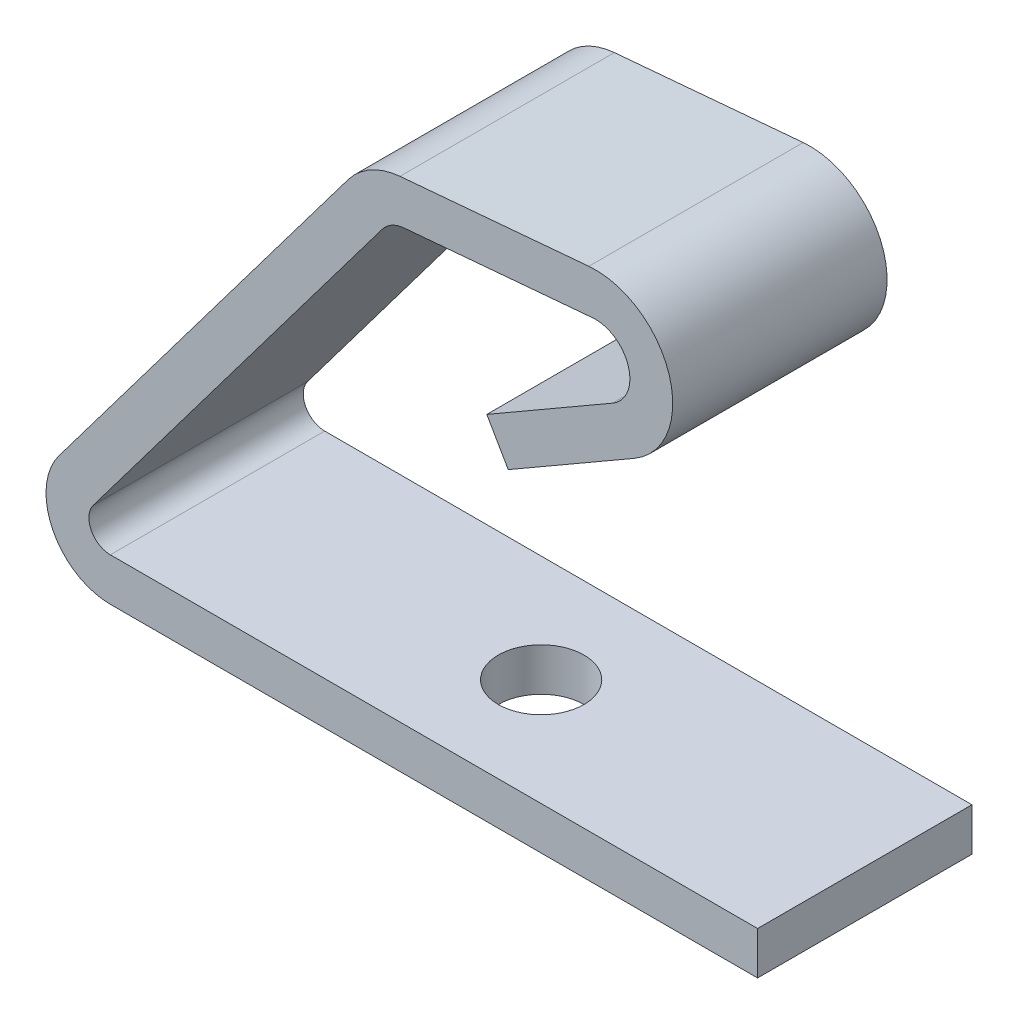
ISO-10303-21;
HEADER;
FILE_DESCRIPTION(('STEP AP214'),'2;1');
FILE_NAME('part.step','',(''),(''),'','','');
FILE_SCHEMA(('AUTOMOTIVE_DESIGN { 1 0 10303 214 1 1 1 1 }'));
ENDSEC;
DATA;
#1=APPLICATION_CONTEXT('core data for automotive mechanical design processes');
#2=APPLICATION_PROTOCOL_DEFINITION('international standard','automotive_design',2000,#1);
#3=PRODUCT_CONTEXT('',#1,'mechanical');
#4=PRODUCT('Part','Part','',(#3));
#5=PRODUCT_RELATED_PRODUCT_CATEGORY('part','',(#4));
#6=PRODUCT_DEFINITION_FORMATION('','',#4);
#7=PRODUCT_DEFINITION_CONTEXT('part definition',#1,'design');
#8=PRODUCT_DEFINITION('design','',#6,#7);
#9=PRODUCT_DEFINITION_SHAPE('','',#8);
#10=(LENGTH_UNIT() NAMED_UNIT(*) SI_UNIT(.MILLI.,.METRE.));
#11=(NAMED_UNIT(*) PLANE_ANGLE_UNIT() SI_UNIT($,.RADIAN.));
#12=(NAMED_UNIT(*) SI_UNIT($,.STERADIAN.) SOLID_ANGLE_UNIT());
#13=UNCERTAINTY_MEASURE_WITH_UNIT(LENGTH_MEASURE(1.E-05),#10,'distance_accuracy_value','');
#14=(GEOMETRIC_REPRESENTATION_CONTEXT(3) GLOBAL_UNCERTAINTY_ASSIGNED_CONTEXT((#13)) GLOBAL_UNIT_ASSIGNED_CONTEXT((#10,
#11,#12)) REPRESENTATION_CONTEXT('',''));
#15=CARTESIAN_POINT('',(0.,0.,0.));
#16=DIRECTION('',(0.,0.,1.));
#17=DIRECTION('',(1.,0.,0.));
#18=AXIS2_PLACEMENT_3D('',#15,#16,#17);
#19=CARTESIAN_POINT('',(11.6209040974575,8.922788872475,5.));
#20=DIRECTION('',(0.499999999999994,-0.866025403784442,0.));
#21=DIRECTION('',(0.866025403784442,0.499999999999994,0.));
#22=AXIS2_PLACEMENT_3D('',#19,#20,#21);
#23=PLANE('',#22);
#24=DIRECTION('',(-0.866025403784442,-0.499999999999994,0.));
#25=VECTOR('',#24,1.);
#26=CARTESIAN_POINT('',(11.6209040974575,8.922788872475,0.));
#27=LINE('',#26,#25);
#28=CARTESIAN_POINT('',(11.6209040974575,8.922788872475,0.));
#29=VERTEX_POINT('',#28);
#30=CARTESIAN_POINT('',(8.68383679355672,7.22707227393987,0.));
#31=VERTEX_POINT('',#30);
#32=EDGE_CURVE('E176',#29,#31,#27,.T.);
#33=ORIENTED_EDGE('',*,*,#32,.T.);
#34=DIRECTION('',(0.,0.,-1.));
#35=VECTOR('',#34,1.);
#36=CARTESIAN_POINT('',(8.68383679355672,7.22707227393987,5.));
#37=LINE('',#36,#35);
#38=CARTESIAN_POINT('',(8.68383679355672,7.22707227393987,5.));
#39=VERTEX_POINT('',#38);
#40=EDGE_CURVE('E11',#39,#31,#37,.T.);
#41=ORIENTED_EDGE('',*,*,#40,.F.);
#42=DIRECTION('',(-0.866025403784442,-0.499999999999994,0.));
#43=VECTOR('',#42,1.);
#44=CARTESIAN_POINT('',(11.6209040974575,8.922788872475,5.));
#45=LINE('',#44,#43);
#46=CARTESIAN_POINT('',(11.6209040974575,8.922788872475,5.));
#47=VERTEX_POINT('',#46);
#48=EDGE_CURVE('E113',#47,#39,#45,.T.);
#49=ORIENTED_EDGE('',*,*,#48,.F.);
#50=DIRECTION('',(0.,0.,-1.));
#51=VECTOR('',#50,1.);
#52=CARTESIAN_POINT('',(11.6209040974575,8.922788872475,5.));
#53=LINE('',#52,#51);
#54=EDGE_CURVE('E172',#47,#29,#53,.T.);
#55=ORIENTED_EDGE('',*,*,#54,.T.);
#56=EDGE_LOOP('',(#33,#41,#49,#55));
#57=FACE_BOUND('',#56,.T.);
#58=ADVANCED_FACE('F33',(#57),#23,.F.);
#59=CARTESIAN_POINT('',(9.18383679355671,6.36104687015543,5.));
#60=DIRECTION('',(-0.866025403784442,-0.499999999999993,0.));
#61=DIRECTION('',(0.499999999999993,-0.866025403784442,0.));
#62=AXIS2_PLACEMENT_3D('',#59,#60,#61);
#63=PLANE('',#62);
#64=DIRECTION('',(-0.499999999999993,0.866025403784442,0.));
#65=VECTOR('',#64,1.);
#66=CARTESIAN_POINT('',(9.18383679355671,6.36104687015543,0.));
#67=LINE('',#66,#65);
#68=CARTESIAN_POINT('',(9.18383679355671,6.36104687015543,0.));
#69=VERTEX_POINT('',#68);
#70=EDGE_CURVE('E179',#69,#31,#67,.T.);
#71=ORIENTED_EDGE('',*,*,#70,.F.);
#72=DIRECTION('',(0.,0.,-1.));
#73=VECTOR('',#72,1.);
#74=CARTESIAN_POINT('',(9.18383679355671,6.36104687015543,5.));
#75=LINE('',#74,#73);
#76=CARTESIAN_POINT('',(9.18383679355671,6.36104687015543,5.));
#77=VERTEX_POINT('',#76);
#78=EDGE_CURVE('E41',#77,#69,#75,.T.);
#79=ORIENTED_EDGE('',*,*,#78,.F.);
#80=DIRECTION('',(-0.499999999999993,0.866025403784442,0.));
#81=VECTOR('',#80,1.);
#82=CARTESIAN_POINT('',(9.18383679355671,6.36104687015543,5.));
#83=LINE('',#82,#81);
#84=EDGE_CURVE('E263',#77,#39,#83,.T.);
#85=ORIENTED_EDGE('',*,*,#84,.T.);
#86=ORIENTED_EDGE('',*,*,#40,.T.);
#87=EDGE_LOOP('',(#71,#79,#85,#86));
#88=FACE_BOUND('',#87,.T.);
#89=ADVANCED_FACE('F250',(#88),#63,.T.);
#90=CARTESIAN_POINT('',(12.1209040974575,8.05676346869056,5.));
#91=DIRECTION('',(0.499999999999994,-0.866025403784442,0.));
#92=DIRECTION('',(0.866025403784442,0.499999999999994,0.));
#93=AXIS2_PLACEMENT_3D('',#90,#91,#92);
#94=PLANE('',#93);
#95=DIRECTION('',(-0.866025403784442,-0.499999999999994,0.));
#96=VECTOR('',#95,1.);
#97=CARTESIAN_POINT('',(12.1209040974575,8.05676346869056,0.));
#98=LINE('',#97,#96);
#99=CARTESIAN_POINT('',(12.1209040974575,8.05676346869056,0.));
#100=VERTEX_POINT('',#99);
#101=EDGE_CURVE('E183',#100,#69,#98,.T.);
#102=ORIENTED_EDGE('',*,*,#101,.F.);
#103=DIRECTION('',(0.,0.,-1.));
#104=VECTOR('',#103,1.);
#105=CARTESIAN_POINT('',(12.1209040974575,8.05676346869056,5.));
#106=LINE('',#105,#104);
#107=CARTESIAN_POINT('',(12.1209040974575,8.05676346869056,5.));
#108=VERTEX_POINT('',#107);
#109=EDGE_CURVE('E240',#108,#100,#106,.T.);
#110=ORIENTED_EDGE('',*,*,#109,.F.);
#111=DIRECTION('',(-0.866025403784442,-0.499999999999994,0.));
#112=VECTOR('',#111,1.);
#113=CARTESIAN_POINT('',(12.1209040974575,8.05676346869056,5.));
#114=LINE('',#113,#112);
#115=EDGE_CURVE('E247',#108,#77,#114,.T.);
#116=ORIENTED_EDGE('',*,*,#115,.T.);
#117=ORIENTED_EDGE('',*,*,#78,.T.);
#118=EDGE_LOOP('',(#102,#110,#116,#117));
#119=FACE_BOUND('',#118,.T.);
#120=ADVANCED_FACE('F245',(#119),#94,.T.);
#121=CARTESIAN_POINT('',(11.2209040974575,9.61560919550256,5.));
#122=DIRECTION('',(0.,0.,-1.));
#123=DIRECTION('',(-1.,0.,0.));
#124=AXIS2_PLACEMENT_3D('',#121,#122,#123);
#125=CYLINDRICAL_SURFACE('',#124,1.8);
#126=CARTESIAN_POINT('',(11.2209040974575,9.61560919550256,0.));
#127=DIRECTION('',(0.,0.,1.));
#128=DIRECTION('',(1.,0.,0.));
#129=AXIS2_PLACEMENT_3D('',#126,#127,#128);
#130=CIRCLE('',#129,1.8);
#131=CARTESIAN_POINT('',(11.0640237605117,11.4087596520677,0.));
#132=VERTEX_POINT('',#131);
#133=EDGE_CURVE('E186',#132,#100,#130,.F.);
#134=ORIENTED_EDGE('',*,*,#133,.F.);
#135=DIRECTION('',(0.,0.,-1.));
#136=VECTOR('',#135,1.);
#137=CARTESIAN_POINT('',(11.0640237605117,11.4087596520677,5.));
#138=LINE('',#137,#136);
#139=CARTESIAN_POINT('',(11.0640237605117,11.4087596520677,5.));
#140=VERTEX_POINT('',#139);
#141=EDGE_CURVE('E238',#140,#132,#138,.T.);
#142=ORIENTED_EDGE('',*,*,#141,.F.);
#143=CARTESIAN_POINT('',(11.2209040974575,9.61560919550256,5.));
#144=DIRECTION('',(0.,0.,1.));
#145=DIRECTION('',(1.,0.,0.));
#146=AXIS2_PLACEMENT_3D('',#143,#144,#145);
#147=CIRCLE('',#146,1.8);
#148=EDGE_CURVE('E260',#140,#108,#147,.F.);
#149=ORIENTED_EDGE('',*,*,#148,.T.);
#150=ORIENTED_EDGE('',*,*,#109,.T.);
#151=EDGE_LOOP('',(#134,#142,#149,#150));
#152=FACE_BOUND('',#151,.T.);
#153=ADVANCED_FACE('F257',(#152),#125,.T.);
#154=CARTESIAN_POINT('',(6.65885887730015,11.0233576638242,5.));
#155=DIRECTION('',(-0.0871557427476582,0.996194698091746,0.));
#156=DIRECTION('',(-0.996194698091746,-0.0871557427476582,0.));
#157=AXIS2_PLACEMENT_3D('',#154,#155,#156);
#158=PLANE('',#157);
#159=DIRECTION('',(0.996194698091746,0.0871557427476582,0.));
#160=VECTOR('',#159,1.);
#161=CARTESIAN_POINT('',(6.65885887730015,11.0233576638242,0.));
#162=LINE('',#161,#160);
#163=CARTESIAN_POINT('',(6.65885887730015,11.0233576638242,0.));
#164=VERTEX_POINT('',#163);
#165=EDGE_CURVE('E189',#164,#132,#162,.T.);
#166=ORIENTED_EDGE('',*,*,#165,.F.);
#167=DIRECTION('',(0.,0.,-1.));
#168=VECTOR('',#167,1.);
#169=CARTESIAN_POINT('',(6.65885887730015,11.0233576638242,5.));
#170=LINE('',#169,#168);
#171=CARTESIAN_POINT('',(6.65885887730015,11.0233576638242,5.));
#172=VERTEX_POINT('',#171);
#173=EDGE_CURVE('E236',#172,#164,#170,.T.);
#174=ORIENTED_EDGE('',*,*,#173,.F.);
#175=DIRECTION('',(0.996194698091746,0.0871557427476582,0.));
#176=VECTOR('',#175,1.);
#177=CARTESIAN_POINT('',(6.65885887730015,11.0233576638242,5.));
#178=LINE('',#177,#176);
#179=EDGE_CURVE('E265',#172,#140,#178,.T.);
#180=ORIENTED_EDGE('',*,*,#179,.T.);
#181=ORIENTED_EDGE('',*,*,#141,.T.);
#182=EDGE_LOOP('',(#166,#174,#180,#181));
#183=FACE_BOUND('',#182,.T.);
#184=ADVANCED_FACE('F322',(#183),#158,.T.);
#185=CARTESIAN_POINT('',(6.80702363997117,9.32982667706822,5.));
#186=DIRECTION('',(0.,0.,-1.));
#187=DIRECTION('',(-1.,0.,0.));
#188=AXIS2_PLACEMENT_3D('',#185,#186,#187);
#189=CYLINDRICAL_SURFACE('',#188,1.7);
#190=CARTESIAN_POINT('',(6.80702363997117,9.32982667706822,0.));
#191=DIRECTION('',(0.,0.,1.));
#192=DIRECTION('',(1.,0.,0.));
#193=AXIS2_PLACEMENT_3D('',#190,#191,#192);
#194=CIRCLE('',#193,1.7);
#195=CARTESIAN_POINT('',(5.44934327289077,10.3529122164267,0.));
#196=VERTEX_POINT('',#195);
#197=EDGE_CURVE('E192',#196,#164,#194,.F.);
#198=ORIENTED_EDGE('',*,*,#197,.F.);
#199=DIRECTION('',(0.,0.,-1.));
#200=VECTOR('',#199,1.);
#201=CARTESIAN_POINT('',(5.44934327289077,10.3529122164267,5.));
#202=LINE('',#201,#200);
#203=CARTESIAN_POINT('',(5.44934327289077,10.3529122164267,5.));
#204=VERTEX_POINT('',#203);
#205=EDGE_CURVE('E234',#204,#196,#202,.T.);
#206=ORIENTED_EDGE('',*,*,#205,.F.);
#207=CARTESIAN_POINT('',(6.80702363997117,9.32982667706822,5.));
#208=DIRECTION('',(0.,0.,1.));
#209=DIRECTION('',(1.,0.,0.));
#210=AXIS2_PLACEMENT_3D('',#207,#208,#209);
#211=CIRCLE('',#210,1.7);
#212=EDGE_CURVE('E271',#204,#172,#211,.F.);
#213=ORIENTED_EDGE('',*,*,#212,.T.);
#214=ORIENTED_EDGE('',*,*,#173,.T.);
#215=EDGE_LOOP('',(#198,#206,#213,#214));
#216=FACE_BOUND('',#215,.T.);
#217=ADVANCED_FACE('F325',(#216),#189,.T.);
#218=CARTESIAN_POINT('',(-1.29510841094143,1.40272253472807,5.));
#219=DIRECTION('',(-0.798635510047294,0.601815023152046,0.));
#220=DIRECTION('',(-0.601815023152046,-0.798635510047294,0.));
#221=AXIS2_PLACEMENT_3D('',#218,#219,#220);
#222=PLANE('',#221);
#223=DIRECTION('',(0.601815023152046,0.798635510047294,0.));
#224=VECTOR('',#223,1.);
#225=CARTESIAN_POINT('',(-1.29510841094143,1.40272253472807,0.));
#226=LINE('',#225,#224);
#227=CARTESIAN_POINT('',(-1.29510841094143,1.40272253472807,0.));
#228=VERTEX_POINT('',#227);
#229=EDGE_CURVE('E195',#228,#196,#226,.T.);
#230=ORIENTED_EDGE('',*,*,#229,.F.);
#231=DIRECTION('',(0.,0.,-1.));
#232=VECTOR('',#231,1.);
#233=CARTESIAN_POINT('',(-1.29510841094143,1.40272253472807,5.));
#234=LINE('',#233,#232);
#235=CARTESIAN_POINT('',(-1.29510841094143,1.40272253472807,5.));
#236=VERTEX_POINT('',#235);
#237=EDGE_CURVE('E232',#236,#228,#234,.T.);
#238=ORIENTED_EDGE('',*,*,#237,.F.);
#239=DIRECTION('',(0.601815023152046,0.798635510047294,0.));
#240=VECTOR('',#239,1.);
#241=CARTESIAN_POINT('',(-1.29510841094143,1.40272253472807,5.));
#242=LINE('',#241,#240);
#243=EDGE_CURVE('E274',#236,#204,#242,.T.);
#244=ORIENTED_EDGE('',*,*,#243,.T.);
#245=ORIENTED_EDGE('',*,*,#205,.T.);
#246=EDGE_LOOP('',(#230,#238,#244,#245));
#247=FACE_BOUND('',#246,.T.);
#248=ADVANCED_FACE('F329',(#247),#222,.T.);
#249=CARTESIAN_POINT('',(-0.0971551458704927,0.5,5.));
#250=DIRECTION('',(0.,0.,-1.));
#251=DIRECTION('',(-1.,0.,0.));
#252=AXIS2_PLACEMENT_3D('',#249,#250,#251);
#253=CYLINDRICAL_SURFACE('',#252,1.5);
#254=CARTESIAN_POINT('',(-0.0971551458704927,0.5,0.));
#255=DIRECTION('',(0.,0.,1.));
#256=DIRECTION('',(1.,0.,0.));
#257=AXIS2_PLACEMENT_3D('',#254,#255,#256);
#258=CIRCLE('',#257,1.5);
#259=CARTESIAN_POINT('',(-0.097155145870493,-1.,0.));
#260=VERTEX_POINT('',#259);
#261=EDGE_CURVE('E198',#260,#228,#258,.F.);
#262=ORIENTED_EDGE('',*,*,#261,.F.);
#263=DIRECTION('',(0.,0.,-1.));
#264=VECTOR('',#263,1.);
#265=CARTESIAN_POINT('',(-0.097155145870493,-1.,5.));
#266=LINE('',#265,#264);
#267=CARTESIAN_POINT('',(-0.097155145870493,-1.,5.));
#268=VERTEX_POINT('',#267);
#269=EDGE_CURVE('E229',#268,#260,#266,.T.);
#270=ORIENTED_EDGE('',*,*,#269,.F.);
#271=CARTESIAN_POINT('',(-0.0971551458704927,0.5,5.));
#272=DIRECTION('',(0.,0.,1.));
#273=DIRECTION('',(1.,0.,0.));
#274=AXIS2_PLACEMENT_3D('',#271,#272,#273);
#275=CIRCLE('',#274,1.5);
#276=EDGE_CURVE('E277',#268,#236,#275,.F.);
#277=ORIENTED_EDGE('',*,*,#276,.T.);
#278=ORIENTED_EDGE('',*,*,#237,.T.);
#279=EDGE_LOOP('',(#262,#270,#277,#278));
#280=FACE_BOUND('',#279,.T.);
#281=ADVANCED_FACE('F333',(#280),#253,.T.);
#282=CARTESIAN_POINT('',(0.,-1.,5.));
#283=DIRECTION('',(0.,-1.,0.));
#284=DIRECTION('',(0.,0.,-1.));
#285=AXIS2_PLACEMENT_3D('',#282,#283,#284);
#286=PLANE('',#285);
#287=CARTESIAN_POINT('',(7.45142242706475,-1.,2.5));
#288=DIRECTION('',(0.,-1.,0.));
#289=DIRECTION('',(0.,0.,-1.));
#290=AXIS2_PLACEMENT_3D('',#287,#288,#289);
#291=CIRCLE('',#290,1.);
#292=CARTESIAN_POINT('',(7.45142242706475,-1.,1.5));
#293=VERTEX_POINT('',#292);
#294=EDGE_CURVE('E405',#293,#293,#291,.F.);
#295=ORIENTED_EDGE('',*,*,#294,.T.);
#296=EDGE_LOOP('',(#295));
#297=FACE_BOUND('',#296,.T.);
#298=DIRECTION('',(1.,0.,0.));
#299=VECTOR('',#298,1.);
#300=CARTESIAN_POINT('',(0.,-1.,0.));
#301=LINE('',#300,#299);
#302=CARTESIAN_POINT('',(15.,-1.,0.));
#303=VERTEX_POINT('',#302);
#304=EDGE_CURVE('E201',#303,#260,#301,.F.);
#305=ORIENTED_EDGE('',*,*,#304,.F.);
#306=DIRECTION('',(0.,0.,-1.));
#307=VECTOR('',#306,1.);
#308=CARTESIAN_POINT('',(15.,-1.,5.));
#309=LINE('',#308,#307);
#310=CARTESIAN_POINT('',(15.,-1.,5.));
#311=VERTEX_POINT('',#310);
#312=EDGE_CURVE('E227',#311,#303,#309,.T.);
#313=ORIENTED_EDGE('',*,*,#312,.F.);
#314=DIRECTION('',(1.,0.,0.));
#315=VECTOR('',#314,1.);
#316=CARTESIAN_POINT('',(0.,-1.,5.));
#317=LINE('',#316,#315);
#318=EDGE_CURVE('E280',#311,#268,#317,.F.);
#319=ORIENTED_EDGE('',*,*,#318,.T.);
#320=ORIENTED_EDGE('',*,*,#269,.T.);
#321=EDGE_LOOP('',(#305,#313,#319,#320));
#322=FACE_BOUND('',#321,.T.);
#323=ADVANCED_FACE('F337',(#297,#322),#286,.T.);
#324=CARTESIAN_POINT('',(15.,0.,5.));
#325=DIRECTION('',(1.,0.,0.));
#326=DIRECTION('',(0.,0.,-1.));
#327=AXIS2_PLACEMENT_3D('',#324,#325,#326);
#328=PLANE('',#327);
#329=DIRECTION('',(0.,-1.,0.));
#330=VECTOR('',#329,1.);
#331=CARTESIAN_POINT('',(15.,0.,0.));
#332=LINE('',#331,#330);
#333=CARTESIAN_POINT('',(15.,0.,0.));
#334=VERTEX_POINT('',#333);
#335=EDGE_CURVE('E203',#334,#303,#332,.T.);
#336=ORIENTED_EDGE('',*,*,#335,.F.);
#337=DIRECTION('',(0.,0.,-1.));
#338=VECTOR('',#337,1.);
#339=CARTESIAN_POINT('',(15.,0.,5.));
#340=LINE('',#339,#338);
#341=CARTESIAN_POINT('',(15.,0.,5.));
#342=VERTEX_POINT('',#341);
#343=EDGE_CURVE('E224',#342,#334,#340,.T.);
#344=ORIENTED_EDGE('',*,*,#343,.F.);
#345=DIRECTION('',(0.,-1.,0.));
#346=VECTOR('',#345,1.);
#347=CARTESIAN_POINT('',(15.,0.,5.));
#348=LINE('',#347,#346);
#349=EDGE_CURVE('E283',#342,#311,#348,.T.);
#350=ORIENTED_EDGE('',*,*,#349,.T.);
#351=ORIENTED_EDGE('',*,*,#312,.T.);
#352=EDGE_LOOP('',(#336,#344,#350,#351));
#353=FACE_BOUND('',#352,.T.);
#354=ADVANCED_FACE('F341',(#353),#328,.T.);
#355=CARTESIAN_POINT('',(0.,0.,5.));
#356=DIRECTION('',(0.,-1.,0.));
#357=DIRECTION('',(0.,0.,-1.));
#358=AXIS2_PLACEMENT_3D('',#355,#356,#357);
#359=PLANE('',#358);
#360=CARTESIAN_POINT('',(7.45142242706475,0.,2.5));
#361=DIRECTION('',(0.,1.,0.));
#362=DIRECTION('',(0.,0.,1.));
#363=AXIS2_PLACEMENT_3D('',#360,#361,#362);
#364=CIRCLE('',#363,1.);
#365=CARTESIAN_POINT('',(7.45142242706475,0.,3.5));
#366=VERTEX_POINT('',#365);
#367=EDGE_CURVE('E180',#366,#366,#364,.T.);
#368=ORIENTED_EDGE('',*,*,#367,.F.);
#369=EDGE_LOOP('',(#368));
#370=FACE_BOUND('',#369,.T.);
#371=DIRECTION('',(-1.,0.,0.));
#372=VECTOR('',#371,1.);
#373=CARTESIAN_POINT('',(0.,0.,0.));
#374=LINE('',#373,#372);
#375=CARTESIAN_POINT('',(-0.0971551458704926,0.,0.));
#376=VERTEX_POINT('',#375);
#377=EDGE_CURVE('E206',#334,#376,#374,.T.);
#378=ORIENTED_EDGE('',*,*,#377,.T.);
#379=DIRECTION('',(0.,0.,-1.));
#380=VECTOR('',#379,1.);
#381=CARTESIAN_POINT('',(-0.0971551458704926,0.,5.));
#382=LINE('',#381,#380);
#383=CARTESIAN_POINT('',(-0.0971551458704926,0.,5.));
#384=VERTEX_POINT('',#383);
#385=EDGE_CURVE('E221',#384,#376,#382,.T.);
#386=ORIENTED_EDGE('',*,*,#385,.F.);
#387=DIRECTION('',(-1.,0.,0.));
#388=VECTOR('',#387,1.);
#389=CARTESIAN_POINT('',(0.,0.,5.));
#390=LINE('',#389,#388);
#391=EDGE_CURVE('E286',#342,#384,#390,.T.);
#392=ORIENTED_EDGE('',*,*,#391,.F.);
#393=ORIENTED_EDGE('',*,*,#343,.T.);
#394=EDGE_LOOP('',(#378,#386,#392,#393));
#395=FACE_BOUND('',#394,.T.);
#396=ADVANCED_FACE('F345',(#370,#395),#359,.F.);
#397=CARTESIAN_POINT('',(-0.0971551458704927,0.5,5.));
#398=DIRECTION('',(0.,0.,-1.));
#399=DIRECTION('',(-1.,0.,0.));
#400=AXIS2_PLACEMENT_3D('',#397,#398,#399);
#401=CYLINDRICAL_SURFACE('',#400,0.5);
#402=CARTESIAN_POINT('',(-0.0971551458704927,0.5,0.));
#403=DIRECTION('',(0.,0.,-1.));
#404=DIRECTION('',(-1.,0.,0.));
#405=AXIS2_PLACEMENT_3D('',#402,#403,#404);
#406=CIRCLE('',#405,0.5);
#407=CARTESIAN_POINT('',(-0.49647290089414,0.800907511576023,0.));
#408=VERTEX_POINT('',#407);
#409=EDGE_CURVE('E208',#376,#408,#406,.T.);
#410=ORIENTED_EDGE('',*,*,#409,.T.);
#411=DIRECTION('',(0.,0.,-1.));
#412=VECTOR('',#411,1.);
#413=CARTESIAN_POINT('',(-0.49647290089414,0.800907511576023,5.));
#414=LINE('',#413,#412);
#415=CARTESIAN_POINT('',(-0.49647290089414,0.800907511576023,5.));
#416=VERTEX_POINT('',#415);
#417=EDGE_CURVE('E218',#416,#408,#414,.T.);
#418=ORIENTED_EDGE('',*,*,#417,.F.);
#419=CARTESIAN_POINT('',(-0.0971551458704927,0.5,5.));
#420=DIRECTION('',(0.,0.,-1.));
#421=DIRECTION('',(-1.,0.,0.));
#422=AXIS2_PLACEMENT_3D('',#419,#420,#421);
#423=CIRCLE('',#422,0.5);
#424=EDGE_CURVE('E288',#384,#416,#423,.T.);
#425=ORIENTED_EDGE('',*,*,#424,.F.);
#426=ORIENTED_EDGE('',*,*,#385,.T.);
#427=EDGE_LOOP('',(#410,#418,#425,#426));
#428=FACE_BOUND('',#427,.T.);
#429=ADVANCED_FACE('F295',(#428),#401,.F.);
#430=CARTESIAN_POINT('',(-0.49647290089414,0.800907511576023,5.));
#431=DIRECTION('',(-0.798635510047294,0.601815023152046,0.));
#432=DIRECTION('',(-0.601815023152046,-0.798635510047294,0.));
#433=AXIS2_PLACEMENT_3D('',#430,#431,#432);
#434=PLANE('',#433);
#435=DIRECTION('',(0.601815023152047,0.798635510047294,0.));
#436=VECTOR('',#435,1.);
#437=CARTESIAN_POINT('',(-0.49647290089414,0.800907511576023,0.));
#438=LINE('',#437,#436);
#439=CARTESIAN_POINT('',(6.24797878293807,9.75109719327465,0.));
#440=VERTEX_POINT('',#439);
#441=EDGE_CURVE('E210',#408,#440,#438,.T.);
#442=ORIENTED_EDGE('',*,*,#441,.T.);
#443=DIRECTION('',(0.,0.,-1.));
#444=VECTOR('',#443,1.);
#445=CARTESIAN_POINT('',(6.24797878293807,9.75109719327465,5.));
#446=LINE('',#445,#444);
#447=CARTESIAN_POINT('',(6.24797878293807,9.75109719327465,5.));
#448=VERTEX_POINT('',#447);
#449=EDGE_CURVE('E167',#448,#440,#446,.T.);
#450=ORIENTED_EDGE('',*,*,#449,.F.);
#451=DIRECTION('',(0.601815023152047,0.798635510047294,0.));
#452=VECTOR('',#451,1.);
#453=CARTESIAN_POINT('',(-0.49647290089414,0.800907511576023,5.));
#454=LINE('',#453,#452);
#455=EDGE_CURVE('E158',#416,#448,#454,.T.);
#456=ORIENTED_EDGE('',*,*,#455,.F.);
#457=ORIENTED_EDGE('',*,*,#417,.T.);
#458=EDGE_LOOP('',(#442,#450,#456,#457));
#459=FACE_BOUND('',#458,.T.);
#460=ADVANCED_FACE('F299',(#459),#434,.F.);
#461=CARTESIAN_POINT('',(6.80702363997117,9.32982667706822,5.));
#462=DIRECTION('',(0.,0.,-1.));
#463=DIRECTION('',(-1.,0.,0.));
#464=AXIS2_PLACEMENT_3D('',#461,#462,#463);
#465=CYLINDRICAL_SURFACE('',#464,0.700000000000001);
#466=CARTESIAN_POINT('',(6.80702363997117,9.32982667706822,0.));
#467=DIRECTION('',(0.,0.,-1.));
#468=DIRECTION('',(-1.,0.,0.));
#469=AXIS2_PLACEMENT_3D('',#466,#467,#468);
#470=CIRCLE('',#469,0.700000000000001);
#471=CARTESIAN_POINT('',(6.74601462004781,10.0271629657324,0.));
#472=VERTEX_POINT('',#471);
#473=EDGE_CURVE('E166',#440,#472,#470,.T.);
#474=ORIENTED_EDGE('',*,*,#473,.T.);
#475=DIRECTION('',(0.,0.,-1.));
#476=VECTOR('',#475,1.);
#477=CARTESIAN_POINT('',(6.74601462004781,10.0271629657324,5.));
#478=LINE('',#477,#476);
#479=CARTESIAN_POINT('',(6.74601462004781,10.0271629657324,5.));
#480=VERTEX_POINT('',#479);
#481=EDGE_CURVE('E163',#480,#472,#478,.T.);
#482=ORIENTED_EDGE('',*,*,#481,.F.);
#483=CARTESIAN_POINT('',(6.80702363997117,9.32982667706822,5.));
#484=DIRECTION('',(0.,0.,-1.));
#485=DIRECTION('',(-1.,0.,0.));
#486=AXIS2_PLACEMENT_3D('',#483,#484,#485);
#487=CIRCLE('',#486,0.700000000000001);
#488=EDGE_CURVE('E152',#448,#480,#487,.T.);
#489=ORIENTED_EDGE('',*,*,#488,.F.);
#490=ORIENTED_EDGE('',*,*,#449,.T.);
#491=EDGE_LOOP('',(#474,#482,#489,#490));
#492=FACE_BOUND('',#491,.T.);
#493=ADVANCED_FACE('F164',(#492),#465,.F.);
#494=CARTESIAN_POINT('',(6.74601462004781,10.0271629657324,5.));
#495=DIRECTION('',(-0.0871557427476582,0.996194698091746,0.));
#496=DIRECTION('',(-0.996194698091746,-0.0871557427476582,0.));
#497=AXIS2_PLACEMENT_3D('',#494,#495,#496);
#498=PLANE('',#497);
#499=DIRECTION('',(0.996194698091746,0.0871557427476582,0.));
#500=VECTOR('',#499,1.);
#501=CARTESIAN_POINT('',(6.74601462004781,10.0271629657324,0.));
#502=LINE('',#501,#500);
#503=CARTESIAN_POINT('',(11.1511795032594,10.412564953976,0.));
#504=VERTEX_POINT('',#503);
#505=EDGE_CURVE('E101',#472,#504,#502,.T.);
#506=ORIENTED_EDGE('',*,*,#505,.T.);
#507=DIRECTION('',(0.,0.,-1.));
#508=VECTOR('',#507,1.);
#509=CARTESIAN_POINT('',(11.1511795032594,10.412564953976,5.));
#510=LINE('',#509,#508);
#511=CARTESIAN_POINT('',(11.1511795032594,10.412564953976,5.));
#512=VERTEX_POINT('',#511);
#513=EDGE_CURVE('E168',#512,#504,#510,.T.);
#514=ORIENTED_EDGE('',*,*,#513,.F.);
#515=DIRECTION('',(0.996194698091746,0.0871557427476582,0.));
#516=VECTOR('',#515,1.);
#517=CARTESIAN_POINT('',(6.74601462004781,10.0271629657324,5.));
#518=LINE('',#517,#516);
#519=EDGE_CURVE('E156',#480,#512,#518,.T.);
#520=ORIENTED_EDGE('',*,*,#519,.F.);
#521=ORIENTED_EDGE('',*,*,#481,.T.);
#522=EDGE_LOOP('',(#506,#514,#520,#521));
#523=FACE_BOUND('',#522,.T.);
#524=ADVANCED_FACE('F170',(#523),#498,.F.);
#525=CARTESIAN_POINT('',(11.2209040974575,9.61560919550256,5.));
#526=DIRECTION('',(0.,0.,-1.));
#527=DIRECTION('',(-1.,0.,0.));
#528=AXIS2_PLACEMENT_3D('',#525,#526,#527);
#529=CYLINDRICAL_SURFACE('',#528,0.799999999999999);
#530=CARTESIAN_POINT('',(11.2209040974575,9.61560919550256,0.));
#531=DIRECTION('',(0.,0.,-1.));
#532=DIRECTION('',(-1.,0.,0.));
#533=AXIS2_PLACEMENT_3D('',#530,#531,#532);
#534=CIRCLE('',#533,0.799999999999999);
#535=EDGE_CURVE('E107',#504,#29,#534,.T.);
#536=ORIENTED_EDGE('',*,*,#535,.T.);
#537=ORIENTED_EDGE('',*,*,#54,.F.);
#538=CARTESIAN_POINT('',(11.2209040974575,9.61560919550256,5.));
#539=DIRECTION('',(0.,0.,-1.));
#540=DIRECTION('',(-1.,0.,0.));
#541=AXIS2_PLACEMENT_3D('',#538,#539,#540);
#542=CIRCLE('',#541,0.799999999999999);
#543=EDGE_CURVE('E49',#512,#47,#542,.T.);
#544=ORIENTED_EDGE('',*,*,#543,.F.);
#545=ORIENTED_EDGE('',*,*,#513,.T.);
#546=EDGE_LOOP('',(#536,#537,#544,#545));
#547=FACE_BOUND('',#546,.T.);
#548=ADVANCED_FACE('F301',(#547),#529,.F.);
#549=CARTESIAN_POINT('',(11.2209040974575,9.61560919550256,5.));
#550=DIRECTION('',(0.,0.,1.));
#551=DIRECTION('',(1.,0.,0.));
#552=AXIS2_PLACEMENT_3D('',#549,#550,#551);
#553=PLANE('',#552);
#554=ORIENTED_EDGE('',*,*,#48,.T.);
#555=ORIENTED_EDGE('',*,*,#84,.F.);
#556=ORIENTED_EDGE('',*,*,#115,.F.);
#557=ORIENTED_EDGE('',*,*,#148,.F.);
#558=ORIENTED_EDGE('',*,*,#179,.F.);
#559=ORIENTED_EDGE('',*,*,#212,.F.);
#560=ORIENTED_EDGE('',*,*,#243,.F.);
#561=ORIENTED_EDGE('',*,*,#276,.F.);
#562=ORIENTED_EDGE('',*,*,#318,.F.);
#563=ORIENTED_EDGE('',*,*,#349,.F.);
#564=ORIENTED_EDGE('',*,*,#391,.T.);
#565=ORIENTED_EDGE('',*,*,#424,.T.);
#566=ORIENTED_EDGE('',*,*,#455,.T.);
#567=ORIENTED_EDGE('',*,*,#488,.T.);
#568=ORIENTED_EDGE('',*,*,#519,.T.);
#569=ORIENTED_EDGE('',*,*,#543,.T.);
#570=EDGE_LOOP('',(#554,#555,#556,#557,#558,#559,#560,#561,#562,#563,#564,#565,#566,#567,#568,#569));
#571=FACE_BOUND('',#570,.T.);
#572=ADVANCED_FACE('F154',(#571),#553,.T.);
#573=CARTESIAN_POINT('',(11.2209040974575,9.61560919550256,0.));
#574=DIRECTION('',(0.,0.,1.));
#575=DIRECTION('',(1.,0.,0.));
#576=AXIS2_PLACEMENT_3D('',#573,#574,#575);
#577=PLANE('',#576);
#578=ORIENTED_EDGE('',*,*,#32,.F.);
#579=ORIENTED_EDGE('',*,*,#535,.F.);
#580=ORIENTED_EDGE('',*,*,#505,.F.);
#581=ORIENTED_EDGE('',*,*,#473,.F.);
#582=ORIENTED_EDGE('',*,*,#441,.F.);
#583=ORIENTED_EDGE('',*,*,#409,.F.);
#584=ORIENTED_EDGE('',*,*,#377,.F.);
#585=ORIENTED_EDGE('',*,*,#335,.T.);
#586=ORIENTED_EDGE('',*,*,#304,.T.);
#587=ORIENTED_EDGE('',*,*,#261,.T.);
#588=ORIENTED_EDGE('',*,*,#229,.T.);
#589=ORIENTED_EDGE('',*,*,#197,.T.);
#590=ORIENTED_EDGE('',*,*,#165,.T.);
#591=ORIENTED_EDGE('',*,*,#133,.T.);
#592=ORIENTED_EDGE('',*,*,#101,.T.);
#593=ORIENTED_EDGE('',*,*,#70,.T.);
#594=EDGE_LOOP('',(#578,#579,#580,#581,#582,#583,#584,#585,#586,#587,#588,#589,#590,#591,#592,#593));
#595=FACE_BOUND('',#594,.T.);
#596=ADVANCED_FACE('F253',(#595),#577,.F.);
#597=CARTESIAN_POINT('',(7.45142242706475,-1.001,2.5));
#598=DIRECTION('',(0.,1.,0.));
#599=DIRECTION('',(0.,0.,1.));
#600=AXIS2_PLACEMENT_3D('',#597,#598,#599);
#601=CYLINDRICAL_SURFACE('',#600,1.);
#602=ORIENTED_EDGE('',*,*,#294,.F.);
#603=EDGE_LOOP('',(#602));
#604=FACE_BOUND('',#603,.T.);
#605=ORIENTED_EDGE('',*,*,#367,.T.);
#606=EDGE_LOOP('',(#605));
#607=FACE_BOUND('',#606,.T.);
#608=ADVANCED_FACE('F381',(#604,#607),#601,.F.);
#609=CLOSED_SHELL('',(#58,#89,#120,#153,#184,#217,#248,#281,#323,#354,#396,#429,#460,#493,#524,
#548,#572,#596,#608));
#610=MANIFOLD_SOLID_BREP('B2',#609);
#611=ADVANCED_BREP_SHAPE_REPRESENTATION('',(#18,#610),#14);
#612=SHAPE_DEFINITION_REPRESENTATION(#9,#611);
ENDSEC;
END-ISO-10303-21;
